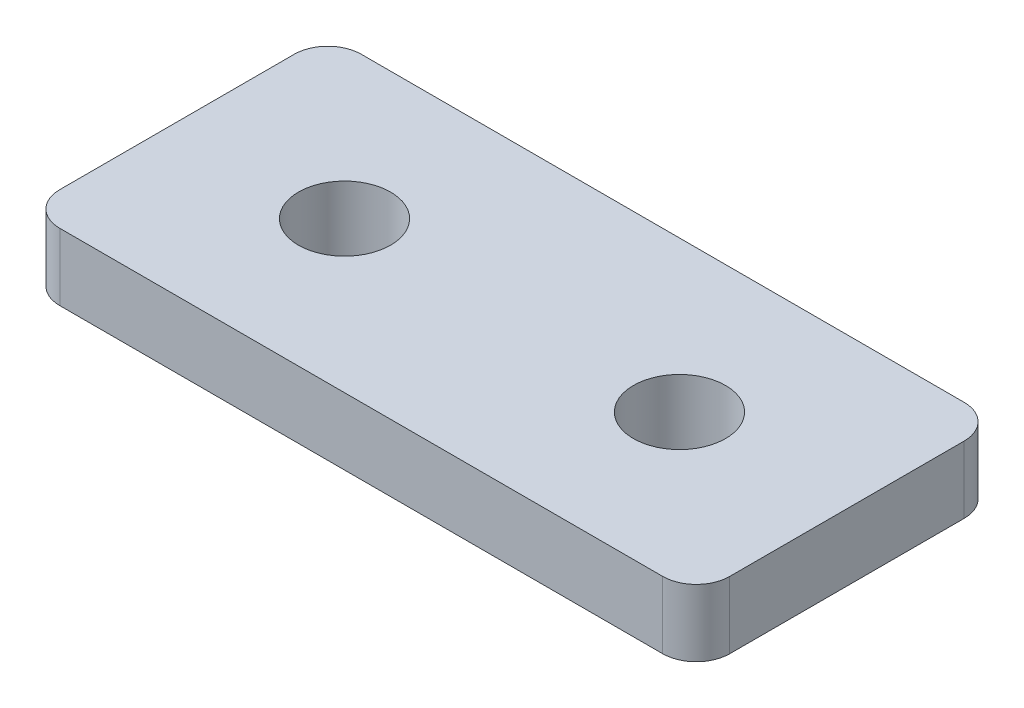
ISO-10303-21;
HEADER;
FILE_DESCRIPTION(('STEP AP214'),'2;1');
FILE_NAME('part.step','',(''),(''),'','','');
FILE_SCHEMA(('AUTOMOTIVE_DESIGN { 1 0 10303 214 1 1 1 1 }'));
ENDSEC;
DATA;
#1=APPLICATION_CONTEXT('core data for automotive mechanical design processes');
#2=APPLICATION_PROTOCOL_DEFINITION('international standard','automotive_design',2000,#1);
#3=PRODUCT_CONTEXT('',#1,'mechanical');
#4=PRODUCT('Part','Part','',(#3));
#5=PRODUCT_RELATED_PRODUCT_CATEGORY('part','',(#4));
#6=PRODUCT_DEFINITION_FORMATION('','',#4);
#7=PRODUCT_DEFINITION_CONTEXT('part definition',#1,'design');
#8=PRODUCT_DEFINITION('design','',#6,#7);
#9=PRODUCT_DEFINITION_SHAPE('','',#8);
#10=(LENGTH_UNIT() NAMED_UNIT(*) SI_UNIT(.MILLI.,.METRE.));
#11=(NAMED_UNIT(*) PLANE_ANGLE_UNIT() SI_UNIT($,.RADIAN.));
#12=(NAMED_UNIT(*) SI_UNIT($,.STERADIAN.) SOLID_ANGLE_UNIT());
#13=UNCERTAINTY_MEASURE_WITH_UNIT(LENGTH_MEASURE(1.E-05),#10,'distance_accuracy_value','');
#14=(GEOMETRIC_REPRESENTATION_CONTEXT(3) GLOBAL_UNCERTAINTY_ASSIGNED_CONTEXT((#13)) GLOBAL_UNIT_ASSIGNED_CONTEXT((#10,
#11,#12)) REPRESENTATION_CONTEXT('',''));
#15=CARTESIAN_POINT('',(0.,0.,0.));
#16=DIRECTION('',(0.,0.,1.));
#17=DIRECTION('',(1.,0.,0.));
#18=AXIS2_PLACEMENT_3D('',#15,#16,#17);
#19=CARTESIAN_POINT('',(20.,4.,9.));
#20=DIRECTION('',(-1.,0.,0.));
#21=DIRECTION('',(0.,0.,1.));
#22=AXIS2_PLACEMENT_3D('',#19,#20,#21);
#23=PLANE('',#22);
#24=DIRECTION('',(0.,0.,-1.));
#25=VECTOR('',#24,1.);
#26=CARTESIAN_POINT('',(20.,0.,9.));
#27=LINE('',#26,#25);
#28=CARTESIAN_POINT('',(20.,0.,7.));
#29=VERTEX_POINT('',#28);
#30=CARTESIAN_POINT('',(20.,0.,-7.));
#31=VERTEX_POINT('',#30);
#32=EDGE_CURVE('E165',#29,#31,#27,.T.);
#33=ORIENTED_EDGE('',*,*,#32,.T.);
#34=DIRECTION('',(0.,-1.,0.));
#35=VECTOR('',#34,1.);
#36=CARTESIAN_POINT('',(20.,4.,-7.));
#37=LINE('',#36,#35);
#38=CARTESIAN_POINT('',(20.,4.,-7.));
#39=VERTEX_POINT('',#38);
#40=EDGE_CURVE('E11',#31,#39,#37,.F.);
#41=ORIENTED_EDGE('',*,*,#40,.T.);
#42=DIRECTION('',(0.,0.,-1.));
#43=VECTOR('',#42,1.);
#44=CARTESIAN_POINT('',(20.,4.,9.));
#45=LINE('',#44,#43);
#46=CARTESIAN_POINT('',(20.,4.,7.));
#47=VERTEX_POINT('',#46);
#48=EDGE_CURVE('E133',#47,#39,#45,.T.);
#49=ORIENTED_EDGE('',*,*,#48,.F.);
#50=DIRECTION('',(0.,-1.,0.));
#51=VECTOR('',#50,1.);
#52=CARTESIAN_POINT('',(20.,4.,7.));
#53=LINE('',#52,#51);
#54=EDGE_CURVE('E49',#47,#29,#53,.T.);
#55=ORIENTED_EDGE('',*,*,#54,.T.);
#56=EDGE_LOOP('',(#33,#41,#49,#55));
#57=FACE_BOUND('',#56,.T.);
#58=ADVANCED_FACE('F41',(#57),#23,.F.);
#59=CARTESIAN_POINT('',(-20.,4.,-9.));
#60=DIRECTION('',(0.,0.,1.));
#61=DIRECTION('',(1.,0.,0.));
#62=AXIS2_PLACEMENT_3D('',#59,#60,#61);
#63=PLANE('',#62);
#64=DIRECTION('',(-1.,0.,0.));
#65=VECTOR('',#64,1.);
#66=CARTESIAN_POINT('',(-20.,0.,-9.));
#67=LINE('',#66,#65);
#68=CARTESIAN_POINT('',(18.,0.,-9.));
#69=VERTEX_POINT('',#68);
#70=CARTESIAN_POINT('',(-18.,0.,-9.));
#71=VERTEX_POINT('',#70);
#72=EDGE_CURVE('E138',#69,#71,#67,.T.);
#73=ORIENTED_EDGE('',*,*,#72,.T.);
#74=DIRECTION('',(0.,-1.,0.));
#75=VECTOR('',#74,1.);
#76=CARTESIAN_POINT('',(-18.,4.,-9.));
#77=LINE('',#76,#75);
#78=CARTESIAN_POINT('',(-18.,4.,-9.));
#79=VERTEX_POINT('',#78);
#80=EDGE_CURVE('E56',#71,#79,#77,.F.);
#81=ORIENTED_EDGE('',*,*,#80,.T.);
#82=DIRECTION('',(-1.,0.,0.));
#83=VECTOR('',#82,1.);
#84=CARTESIAN_POINT('',(-20.,4.,-9.));
#85=LINE('',#84,#83);
#86=CARTESIAN_POINT('',(18.,4.,-9.));
#87=VERTEX_POINT('',#86);
#88=EDGE_CURVE('E136',#87,#79,#85,.T.);
#89=ORIENTED_EDGE('',*,*,#88,.F.);
#90=DIRECTION('',(0.,-1.,0.));
#91=VECTOR('',#90,1.);
#92=CARTESIAN_POINT('',(18.,4.,-9.));
#93=LINE('',#92,#91);
#94=EDGE_CURVE('E157',#87,#69,#93,.T.);
#95=ORIENTED_EDGE('',*,*,#94,.T.);
#96=EDGE_LOOP('',(#73,#81,#89,#95));
#97=FACE_BOUND('',#96,.T.);
#98=ADVANCED_FACE('F204',(#97),#63,.F.);
#99=CARTESIAN_POINT('',(-20.,4.,9.));
#100=DIRECTION('',(1.,0.,0.));
#101=DIRECTION('',(0.,0.,-1.));
#102=AXIS2_PLACEMENT_3D('',#99,#100,#101);
#103=PLANE('',#102);
#104=DIRECTION('',(0.,0.,1.));
#105=VECTOR('',#104,1.);
#106=CARTESIAN_POINT('',(-20.,0.,9.));
#107=LINE('',#106,#105);
#108=CARTESIAN_POINT('',(-20.,0.,-7.));
#109=VERTEX_POINT('',#108);
#110=CARTESIAN_POINT('',(-20.,0.,7.));
#111=VERTEX_POINT('',#110);
#112=EDGE_CURVE('E134',#109,#111,#107,.T.);
#113=ORIENTED_EDGE('',*,*,#112,.T.);
#114=DIRECTION('',(0.,-1.,0.));
#115=VECTOR('',#114,1.);
#116=CARTESIAN_POINT('',(-20.,4.,7.));
#117=LINE('',#116,#115);
#118=CARTESIAN_POINT('',(-20.,4.,7.));
#119=VERTEX_POINT('',#118);
#120=EDGE_CURVE('E112',#111,#119,#117,.F.);
#121=ORIENTED_EDGE('',*,*,#120,.T.);
#122=DIRECTION('',(0.,0.,1.));
#123=VECTOR('',#122,1.);
#124=CARTESIAN_POINT('',(-20.,4.,9.));
#125=LINE('',#124,#123);
#126=CARTESIAN_POINT('',(-20.,4.,-7.));
#127=VERTEX_POINT('',#126);
#128=EDGE_CURVE('E177',#127,#119,#125,.T.);
#129=ORIENTED_EDGE('',*,*,#128,.F.);
#130=DIRECTION('',(0.,-1.,0.));
#131=VECTOR('',#130,1.);
#132=CARTESIAN_POINT('',(-20.,4.,-7.));
#133=LINE('',#132,#131);
#134=EDGE_CURVE('E117',#127,#109,#133,.T.);
#135=ORIENTED_EDGE('',*,*,#134,.T.);
#136=EDGE_LOOP('',(#113,#121,#129,#135));
#137=FACE_BOUND('',#136,.T.);
#138=ADVANCED_FACE('F201',(#137),#103,.F.);
#139=CARTESIAN_POINT('',(-20.,4.,9.));
#140=DIRECTION('',(0.,0.,-1.));
#141=DIRECTION('',(-1.,0.,0.));
#142=AXIS2_PLACEMENT_3D('',#139,#140,#141);
#143=PLANE('',#142);
#144=DIRECTION('',(1.,0.,0.));
#145=VECTOR('',#144,1.);
#146=CARTESIAN_POINT('',(-20.,4.,9.));
#147=LINE('',#146,#145);
#148=CARTESIAN_POINT('',(-18.,4.,9.));
#149=VERTEX_POINT('',#148);
#150=CARTESIAN_POINT('',(18.,4.,9.));
#151=VERTEX_POINT('',#150);
#152=EDGE_CURVE('E127',#149,#151,#147,.T.);
#153=ORIENTED_EDGE('',*,*,#152,.F.);
#154=DIRECTION('',(0.,-1.,0.));
#155=VECTOR('',#154,1.);
#156=CARTESIAN_POINT('',(-18.,4.,9.));
#157=LINE('',#156,#155);
#158=CARTESIAN_POINT('',(-18.,0.,9.));
#159=VERTEX_POINT('',#158);
#160=EDGE_CURVE('E111',#149,#159,#157,.T.);
#161=ORIENTED_EDGE('',*,*,#160,.T.);
#162=DIRECTION('',(1.,0.,0.));
#163=VECTOR('',#162,1.);
#164=CARTESIAN_POINT('',(-20.,0.,9.));
#165=LINE('',#164,#163);
#166=CARTESIAN_POINT('',(18.,0.,9.));
#167=VERTEX_POINT('',#166);
#168=EDGE_CURVE('E124',#159,#167,#165,.T.);
#169=ORIENTED_EDGE('',*,*,#168,.T.);
#170=DIRECTION('',(0.,-1.,0.));
#171=VECTOR('',#170,1.);
#172=CARTESIAN_POINT('',(18.,4.,9.));
#173=LINE('',#172,#171);
#174=EDGE_CURVE('E129',#167,#151,#173,.F.);
#175=ORIENTED_EDGE('',*,*,#174,.T.);
#176=EDGE_LOOP('',(#153,#161,#169,#175));
#177=FACE_BOUND('',#176,.T.);
#178=ADVANCED_FACE('F123',(#177),#143,.F.);
#179=CARTESIAN_POINT('',(0.,4.,0.));
#180=DIRECTION('',(0.,-1.,0.));
#181=DIRECTION('',(0.,0.,-1.));
#182=AXIS2_PLACEMENT_3D('',#179,#180,#181);
#183=PLANE('',#182);
#184=CARTESIAN_POINT('',(-10.,4.,0.));
#185=DIRECTION('',(0.,1.,0.));
#186=DIRECTION('',(0.,0.,1.));
#187=AXIS2_PLACEMENT_3D('',#184,#185,#186);
#188=CIRCLE('',#187,2.75);
#189=CARTESIAN_POINT('',(-10.,4.,2.75));
#190=VERTEX_POINT('',#189);
#191=EDGE_CURVE('E173',#190,#190,#188,.T.);
#192=ORIENTED_EDGE('',*,*,#191,.F.);
#193=EDGE_LOOP('',(#192));
#194=FACE_BOUND('',#193,.T.);
#195=CARTESIAN_POINT('',(10.,4.,0.));
#196=DIRECTION('',(0.,1.,0.));
#197=DIRECTION('',(0.,0.,-1.));
#198=AXIS2_PLACEMENT_3D('',#195,#196,#197);
#199=CIRCLE('',#198,2.75);
#200=CARTESIAN_POINT('',(10.,4.,-2.75));
#201=VERTEX_POINT('',#200);
#202=EDGE_CURVE('E184',#201,#201,#199,.T.);
#203=ORIENTED_EDGE('',*,*,#202,.F.);
#204=EDGE_LOOP('',(#203));
#205=FACE_BOUND('',#204,.T.);
#206=ORIENTED_EDGE('',*,*,#128,.T.);
#207=CARTESIAN_POINT('',(-18.,4.,7.));
#208=DIRECTION('',(0.,-1.,0.));
#209=DIRECTION('',(0.,0.,-1.));
#210=AXIS2_PLACEMENT_3D('',#207,#208,#209);
#211=CIRCLE('',#210,2.);
#212=EDGE_CURVE('E155',#119,#149,#211,.F.);
#213=ORIENTED_EDGE('',*,*,#212,.T.);
#214=ORIENTED_EDGE('',*,*,#152,.T.);
#215=CARTESIAN_POINT('',(18.,4.,7.));
#216=DIRECTION('',(0.,-1.,0.));
#217=DIRECTION('',(0.,0.,-1.));
#218=AXIS2_PLACEMENT_3D('',#215,#216,#217);
#219=CIRCLE('',#218,2.);
#220=EDGE_CURVE('E150',#151,#47,#219,.F.);
#221=ORIENTED_EDGE('',*,*,#220,.T.);
#222=ORIENTED_EDGE('',*,*,#48,.T.);
#223=CARTESIAN_POINT('',(18.,4.,-7.));
#224=DIRECTION('',(0.,-1.,0.));
#225=DIRECTION('',(0.,0.,-1.));
#226=AXIS2_PLACEMENT_3D('',#223,#224,#225);
#227=CIRCLE('',#226,2.);
#228=EDGE_CURVE('E63',#39,#87,#227,.F.);
#229=ORIENTED_EDGE('',*,*,#228,.T.);
#230=ORIENTED_EDGE('',*,*,#88,.T.);
#231=CARTESIAN_POINT('',(-18.,4.,-7.));
#232=DIRECTION('',(0.,-1.,0.));
#233=DIRECTION('',(0.,0.,-1.));
#234=AXIS2_PLACEMENT_3D('',#231,#232,#233);
#235=CIRCLE('',#234,2.);
#236=EDGE_CURVE('E153',#79,#127,#235,.F.);
#237=ORIENTED_EDGE('',*,*,#236,.T.);
#238=EDGE_LOOP('',(#206,#213,#214,#221,#222,#229,#230,#237));
#239=FACE_BOUND('',#238,.T.);
#240=ADVANCED_FACE('F192',(#194,#205,#239),#183,.F.);
#241=CARTESIAN_POINT('',(0.,0.,0.));
#242=DIRECTION('',(0.,-1.,0.));
#243=DIRECTION('',(0.,0.,-1.));
#244=AXIS2_PLACEMENT_3D('',#241,#242,#243);
#245=PLANE('',#244);
#246=CARTESIAN_POINT('',(-10.,0.,0.));
#247=DIRECTION('',(0.,1.,0.));
#248=DIRECTION('',(0.,0.,1.));
#249=AXIS2_PLACEMENT_3D('',#246,#247,#248);
#250=CIRCLE('',#249,2.75);
#251=CARTESIAN_POINT('',(-10.,0.,2.75));
#252=VERTEX_POINT('',#251);
#253=EDGE_CURVE('E170',#252,#252,#250,.T.);
#254=ORIENTED_EDGE('',*,*,#253,.T.);
#255=EDGE_LOOP('',(#254));
#256=FACE_BOUND('',#255,.T.);
#257=CARTESIAN_POINT('',(10.,0.,0.));
#258=DIRECTION('',(0.,1.,0.));
#259=DIRECTION('',(0.,0.,-1.));
#260=AXIS2_PLACEMENT_3D('',#257,#258,#259);
#261=CIRCLE('',#260,2.75);
#262=CARTESIAN_POINT('',(10.,0.,-2.75));
#263=VERTEX_POINT('',#262);
#264=EDGE_CURVE('E181',#263,#263,#261,.T.);
#265=ORIENTED_EDGE('',*,*,#264,.T.);
#266=EDGE_LOOP('',(#265));
#267=FACE_BOUND('',#266,.T.);
#268=ORIENTED_EDGE('',*,*,#168,.F.);
#269=CARTESIAN_POINT('',(-18.,0.,7.));
#270=DIRECTION('',(0.,-1.,0.));
#271=DIRECTION('',(0.,0.,-1.));
#272=AXIS2_PLACEMENT_3D('',#269,#270,#271);
#273=CIRCLE('',#272,2.);
#274=EDGE_CURVE('E107',#159,#111,#273,.T.);
#275=ORIENTED_EDGE('',*,*,#274,.T.);
#276=ORIENTED_EDGE('',*,*,#112,.F.);
#277=CARTESIAN_POINT('',(-18.,0.,-7.));
#278=DIRECTION('',(0.,-1.,0.));
#279=DIRECTION('',(0.,0.,-1.));
#280=AXIS2_PLACEMENT_3D('',#277,#278,#279);
#281=CIRCLE('',#280,2.);
#282=EDGE_CURVE('E118',#109,#71,#281,.T.);
#283=ORIENTED_EDGE('',*,*,#282,.T.);
#284=ORIENTED_EDGE('',*,*,#72,.F.);
#285=CARTESIAN_POINT('',(18.,0.,-7.));
#286=DIRECTION('',(0.,-1.,0.));
#287=DIRECTION('',(0.,0.,-1.));
#288=AXIS2_PLACEMENT_3D('',#285,#286,#287);
#289=CIRCLE('',#288,2.);
#290=EDGE_CURVE('E144',#69,#31,#289,.T.);
#291=ORIENTED_EDGE('',*,*,#290,.T.);
#292=ORIENTED_EDGE('',*,*,#32,.F.);
#293=CARTESIAN_POINT('',(18.,0.,7.));
#294=DIRECTION('',(0.,-1.,0.));
#295=DIRECTION('',(0.,0.,-1.));
#296=AXIS2_PLACEMENT_3D('',#293,#294,#295);
#297=CIRCLE('',#296,2.);
#298=EDGE_CURVE('E128',#29,#167,#297,.T.);
#299=ORIENTED_EDGE('',*,*,#298,.T.);
#300=EDGE_LOOP('',(#268,#275,#276,#283,#284,#291,#292,#299));
#301=FACE_BOUND('',#300,.T.);
#302=ADVANCED_FACE('F131',(#256,#267,#301),#245,.T.);
#303=CARTESIAN_POINT('',(10.,0.,0.));
#304=DIRECTION('',(0.,1.,0.));
#305=DIRECTION('',(0.,0.,1.));
#306=AXIS2_PLACEMENT_3D('',#303,#304,#305);
#307=CYLINDRICAL_SURFACE('',#306,2.75);
#308=ORIENTED_EDGE('',*,*,#264,.F.);
#309=EDGE_LOOP('',(#308));
#310=FACE_BOUND('',#309,.T.);
#311=ORIENTED_EDGE('',*,*,#202,.T.);
#312=EDGE_LOOP('',(#311));
#313=FACE_BOUND('',#312,.T.);
#314=ADVANCED_FACE('F250',(#310,#313),#307,.F.);
#315=CARTESIAN_POINT('',(-10.,0.,0.));
#316=DIRECTION('',(0.,1.,0.));
#317=DIRECTION('',(0.,0.,1.));
#318=AXIS2_PLACEMENT_3D('',#315,#316,#317);
#319=CYLINDRICAL_SURFACE('',#318,2.75);
#320=ORIENTED_EDGE('',*,*,#253,.F.);
#321=EDGE_LOOP('',(#320));
#322=FACE_BOUND('',#321,.T.);
#323=ORIENTED_EDGE('',*,*,#191,.T.);
#324=EDGE_LOOP('',(#323));
#325=FACE_BOUND('',#324,.T.);
#326=ADVANCED_FACE('F190',(#322,#325),#319,.F.);
#327=CARTESIAN_POINT('',(-18.,4.,7.));
#328=DIRECTION('',(0.,-1.,0.));
#329=DIRECTION('',(0.,0.,-1.));
#330=AXIS2_PLACEMENT_3D('',#327,#328,#329);
#331=CYLINDRICAL_SURFACE('',#330,2.);
#332=ORIENTED_EDGE('',*,*,#212,.F.);
#333=ORIENTED_EDGE('',*,*,#120,.F.);
#334=ORIENTED_EDGE('',*,*,#274,.F.);
#335=ORIENTED_EDGE('',*,*,#160,.F.);
#336=EDGE_LOOP('',(#332,#333,#334,#335));
#337=FACE_BOUND('',#336,.T.);
#338=ADVANCED_FACE('F110',(#337),#331,.T.);
#339=CARTESIAN_POINT('',(-18.,4.,-7.));
#340=DIRECTION('',(0.,-1.,0.));
#341=DIRECTION('',(0.,0.,-1.));
#342=AXIS2_PLACEMENT_3D('',#339,#340,#341);
#343=CYLINDRICAL_SURFACE('',#342,2.);
#344=ORIENTED_EDGE('',*,*,#236,.F.);
#345=ORIENTED_EDGE('',*,*,#80,.F.);
#346=ORIENTED_EDGE('',*,*,#282,.F.);
#347=ORIENTED_EDGE('',*,*,#134,.F.);
#348=EDGE_LOOP('',(#344,#345,#346,#347));
#349=FACE_BOUND('',#348,.T.);
#350=ADVANCED_FACE('F203',(#349),#343,.T.);
#351=CARTESIAN_POINT('',(18.,4.,-7.));
#352=DIRECTION('',(0.,-1.,0.));
#353=DIRECTION('',(0.,0.,-1.));
#354=AXIS2_PLACEMENT_3D('',#351,#352,#353);
#355=CYLINDRICAL_SURFACE('',#354,2.);
#356=ORIENTED_EDGE('',*,*,#228,.F.);
#357=ORIENTED_EDGE('',*,*,#40,.F.);
#358=ORIENTED_EDGE('',*,*,#290,.F.);
#359=ORIENTED_EDGE('',*,*,#94,.F.);
#360=EDGE_LOOP('',(#356,#357,#358,#359));
#361=FACE_BOUND('',#360,.T.);
#362=ADVANCED_FACE('F207',(#361),#355,.T.);
#363=CARTESIAN_POINT('',(18.,4.,7.));
#364=DIRECTION('',(0.,-1.,0.));
#365=DIRECTION('',(0.,0.,-1.));
#366=AXIS2_PLACEMENT_3D('',#363,#364,#365);
#367=CYLINDRICAL_SURFACE('',#366,2.);
#368=ORIENTED_EDGE('',*,*,#220,.F.);
#369=ORIENTED_EDGE('',*,*,#174,.F.);
#370=ORIENTED_EDGE('',*,*,#298,.F.);
#371=ORIENTED_EDGE('',*,*,#54,.F.);
#372=EDGE_LOOP('',(#368,#369,#370,#371));
#373=FACE_BOUND('',#372,.T.);
#374=ADVANCED_FACE('F43',(#373),#367,.T.);
#375=CLOSED_SHELL('',(#58,#98,#138,#178,#240,#302,#314,#326,#338,#350,#362,#374));
#376=MANIFOLD_SOLID_BREP('B2',#375);
#377=ADVANCED_BREP_SHAPE_REPRESENTATION('',(#18,#376),#14);
#378=SHAPE_DEFINITION_REPRESENTATION(#9,#377);
ENDSEC;
END-ISO-10303-21;
